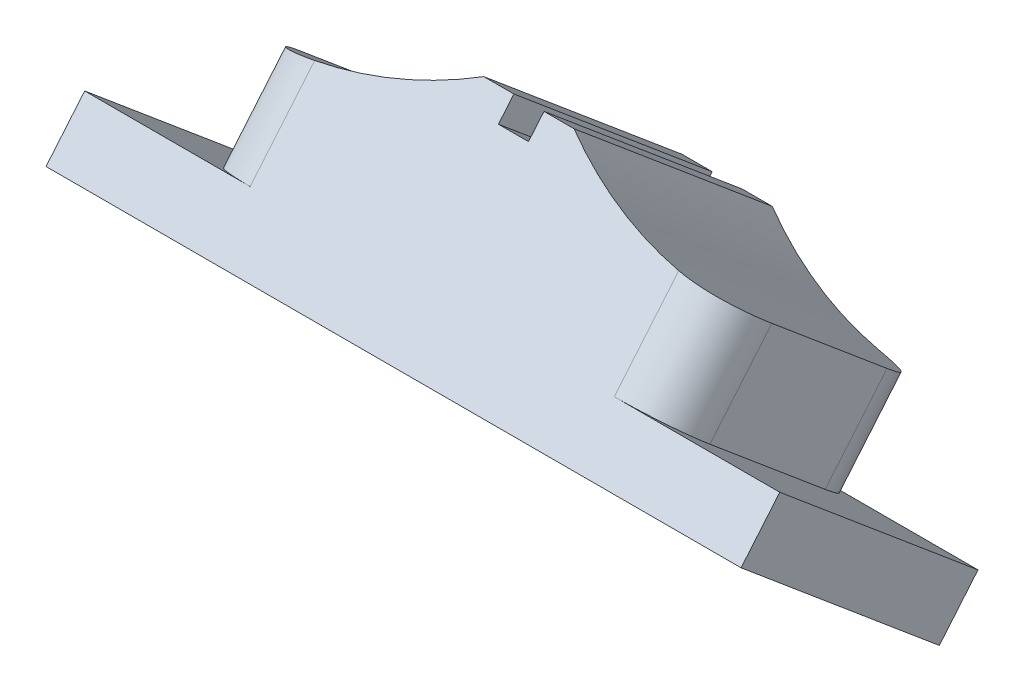
ISO-10303-21;
HEADER;
FILE_DESCRIPTION(('STEP AP214'),'2;1');
FILE_NAME('part.step','',(''),(''),'','','');
FILE_SCHEMA(('AUTOMOTIVE_DESIGN { 1 0 10303 214 1 1 1 1 }'));
ENDSEC;
DATA;
#1=APPLICATION_CONTEXT('core data for automotive mechanical design processes');
#2=APPLICATION_PROTOCOL_DEFINITION('international standard','automotive_design',2000,#1);
#3=PRODUCT_CONTEXT('',#1,'mechanical');
#4=PRODUCT('Part','Part','',(#3));
#5=PRODUCT_RELATED_PRODUCT_CATEGORY('part','',(#4));
#6=PRODUCT_DEFINITION_FORMATION('','',#4);
#7=PRODUCT_DEFINITION_CONTEXT('part definition',#1,'design');
#8=PRODUCT_DEFINITION('design','',#6,#7);
#9=PRODUCT_DEFINITION_SHAPE('','',#8);
#10=(LENGTH_UNIT() NAMED_UNIT(*) SI_UNIT(.MILLI.,.METRE.));
#11=(NAMED_UNIT(*) PLANE_ANGLE_UNIT() SI_UNIT($,.RADIAN.));
#12=(NAMED_UNIT(*) SI_UNIT($,.STERADIAN.) SOLID_ANGLE_UNIT());
#13=UNCERTAINTY_MEASURE_WITH_UNIT(LENGTH_MEASURE(1.E-05),#10,'distance_accuracy_value','');
#14=(GEOMETRIC_REPRESENTATION_CONTEXT(3) GLOBAL_UNCERTAINTY_ASSIGNED_CONTEXT((#13)) GLOBAL_UNIT_ASSIGNED_CONTEXT((#10,
#11,#12)) REPRESENTATION_CONTEXT('',''));
#15=CARTESIAN_POINT('',(0.,0.,0.));
#16=DIRECTION('',(0.,0.,1.));
#17=DIRECTION('',(1.,0.,0.));
#18=AXIS2_PLACEMENT_3D('',#15,#16,#17);
#19=CARTESIAN_POINT('',(27.,-209.156915838165,-15.7245982633083));
#20=DIRECTION('',(0.,-0.766044443118977,0.642787609686541));
#21=DIRECTION('',(0.,-0.642787609686541,-0.766044443118977));
#22=AXIS2_PLACEMENT_3D('',#19,#20,#21);
#23=PLANE('',#22);
#24=DIRECTION('',(0.,-0.642787609686541,-0.766044443118977));
#25=VECTOR('',#24,1.);
#26=CARTESIAN_POINT('',(-0.249999999999999,-213.992288139613,-21.4871705750898));
#27=LINE('',#26,#25);
#28=CARTESIAN_POINT('',(-0.249999999999999,-216.207865915071,-24.1275933486641));
#29=VERTEX_POINT('',#28);
#30=CARTESIAN_POINT('',(-0.249999999999999,-221.735839358376,-30.7155755594873));
#31=VERTEX_POINT('',#30);
#32=EDGE_CURVE('E63',#29,#31,#27,.T.);
#33=ORIENTED_EDGE('',*,*,#32,.F.);
#34=DIRECTION('',(-1.,0.,0.));
#35=VECTOR('',#34,1.);
#36=CARTESIAN_POINT('',(7.3,-216.207865915071,-24.1275933486641));
#37=LINE('',#36,#35);
#38=CARTESIAN_POINT('',(0.750000000000001,-216.207865915071,-24.1275933486641));
#39=VERTEX_POINT('',#38);
#40=EDGE_CURVE('E362',#39,#29,#37,.T.);
#41=ORIENTED_EDGE('',*,*,#40,.F.);
#42=DIRECTION('',(0.,-0.642787609686541,-0.766044443118977));
#43=VECTOR('',#42,1.);
#44=CARTESIAN_POINT('',(0.750000000000001,-213.992288139613,-21.4871705750898));
#45=LINE('',#44,#43);
#46=CARTESIAN_POINT('',(0.750000000000001,-221.735839358376,-30.7155755594874));
#47=VERTEX_POINT('',#46);
#48=EDGE_CURVE('E238',#39,#47,#45,.T.);
#49=ORIENTED_EDGE('',*,*,#48,.T.);
#50=DIRECTION('',(1.,0.,0.));
#51=VECTOR('',#50,1.);
#52=CARTESIAN_POINT('',(7.3,-221.735839358376,-30.7155755594873));
#53=LINE('',#52,#51);
#54=EDGE_CURVE('E358',#31,#47,#53,.T.);
#55=ORIENTED_EDGE('',*,*,#54,.F.);
#56=EDGE_LOOP('',(#33,#41,#49,#55));
#57=FACE_BOUND('',#56,.T.);
#58=ADVANCED_FACE('F39',(#57),#23,.F.);
#59=CARTESIAN_POINT('',(7.3,-200.196681165017,-37.5625725671458));
#60=DIRECTION('',(0.,-0.642787609686541,-0.766044443118977));
#61=DIRECTION('',(0.,0.766044443118977,-0.642787609686541));
#62=AXIS2_PLACEMENT_3D('',#59,#60,#61);
#63=PLANE('',#62);
#64=CARTESIAN_POINT('',(-6.6,-208.317076175638,-30.7487521087201));
#65=DIRECTION('',(0.,-0.642787609686541,-0.766044443118977));
#66=DIRECTION('',(0.,0.766044443118977,-0.642787609686541));
#67=AXIS2_PLACEMENT_3D('',#64,#65,#66);
#68=CIRCLE('',#67,12.1006944444446);
#69=CARTESIAN_POINT('',(-4.8,-217.483616798257,-23.0571112531094));
#70=VERTEX_POINT('',#69);
#71=EDGE_CURVE('E405',#70,#29,#68,.F.);
#72=ORIENTED_EDGE('',*,*,#71,.F.);
#73=DIRECTION('',(0.,-0.766044443118977,0.642787609686541));
#74=VECTOR('',#73,1.);
#75=CARTESIAN_POINT('',(-4.8,-200.196681165017,-37.5625725671458));
#76=LINE('',#75,#74);
#77=CARTESIAN_POINT('',(-4.8,-220.038088130667,-20.9136553002312));
#78=VERTEX_POINT('',#77);
#79=EDGE_CURVE('E388',#70,#78,#76,.T.);
#80=ORIENTED_EDGE('',*,*,#79,.T.);
#81=DIRECTION('',(-1.,0.,0.));
#82=VECTOR('',#81,1.);
#83=CARTESIAN_POINT('',(12.8,-220.038088130667,-20.9136553002312));
#84=LINE('',#83,#82);
#85=CARTESIAN_POINT('',(-10.3,-220.038088130667,-20.9136553002312));
#86=VERTEX_POINT('',#85);
#87=EDGE_CURVE('E423',#78,#86,#84,.T.);
#88=ORIENTED_EDGE('',*,*,#87,.T.);
#89=DIRECTION('',(0.,0.766044443118977,-0.642787609686541));
#90=VECTOR('',#89,1.);
#91=CARTESIAN_POINT('',(-10.3,-221.570177016904,-19.6280800808581));
#92=LINE('',#91,#90);
#93=CARTESIAN_POINT('',(-10.3,-221.570177016904,-19.6280800808581));
#94=VERTEX_POINT('',#93);
#95=EDGE_CURVE('E470',#94,#86,#92,.T.);
#96=ORIENTED_EDGE('',*,*,#95,.F.);
#97=DIRECTION('',(-1.,0.,0.));
#98=VECTOR('',#97,1.);
#99=CARTESIAN_POINT('',(12.8,-221.570177016904,-19.6280800808581));
#100=LINE('',#99,#98);
#101=CARTESIAN_POINT('',(12.8,-221.570177016904,-19.6280800808581));
#102=VERTEX_POINT('',#101);
#103=EDGE_CURVE('E483',#102,#94,#100,.T.);
#104=ORIENTED_EDGE('',*,*,#103,.F.);
#105=DIRECTION('',(0.,0.766044443118977,-0.642787609686541));
#106=VECTOR('',#105,1.);
#107=CARTESIAN_POINT('',(12.8,-221.570177016904,-19.6280800808581));
#108=LINE('',#107,#106);
#109=CARTESIAN_POINT('',(12.8,-220.038088130667,-20.9136553002312));
#110=VERTEX_POINT('',#109);
#111=EDGE_CURVE('E366',#102,#110,#108,.T.);
#112=ORIENTED_EDGE('',*,*,#111,.T.);
#113=CARTESIAN_POINT('',(7.3,-220.038088130667,-20.9136553002312));
#114=VERTEX_POINT('',#113);
#115=EDGE_CURVE('E449',#110,#114,#84,.T.);
#116=ORIENTED_EDGE('',*,*,#115,.T.);
#117=DIRECTION('',(0.,-0.766044443118977,0.642787609686541));
#118=VECTOR('',#117,1.);
#119=CARTESIAN_POINT('',(7.3,-200.196681165017,-37.5625725671458));
#120=LINE('',#119,#118);
#121=CARTESIAN_POINT('',(7.3,-217.483616798257,-23.0571112531094));
#122=VERTEX_POINT('',#121);
#123=EDGE_CURVE('E386',#122,#114,#120,.T.);
#124=ORIENTED_EDGE('',*,*,#123,.F.);
#125=CARTESIAN_POINT('',(9.1,-208.317076175638,-30.7487521087201));
#126=DIRECTION('',(0.,-0.642787609686541,-0.766044443118977));
#127=DIRECTION('',(0.,0.766044443118977,-0.642787609686541));
#128=AXIS2_PLACEMENT_3D('',#125,#126,#127);
#129=CIRCLE('',#128,12.1006944444446);
#130=CARTESIAN_POINT('',(2.75,-216.207865915071,-24.1275933486641));
#131=VERTEX_POINT('',#130);
#132=EDGE_CURVE('E310',#122,#131,#129,.T.);
#133=ORIENTED_EDGE('',*,*,#132,.T.);
#134=CARTESIAN_POINT('',(1.75,-216.207865915071,-24.1275933486641));
#135=VERTEX_POINT('',#134);
#136=EDGE_CURVE('E359',#131,#135,#37,.T.);
#137=ORIENTED_EDGE('',*,*,#136,.T.);
#138=DIRECTION('',(0.,-0.766044443118977,0.642787609686541));
#139=VECTOR('',#138,1.);
#140=CARTESIAN_POINT('',(1.75000000000001,-200.196681165017,-37.5625725671458));
#141=LINE('',#140,#139);
#142=CARTESIAN_POINT('',(1.75,-216.820701469567,-23.6133632609148));
#143=VERTEX_POINT('',#142);
#144=EDGE_CURVE('E309',#135,#143,#141,.T.);
#145=ORIENTED_EDGE('',*,*,#144,.T.);
#146=DIRECTION('',(-1.,0.,0.));
#147=VECTOR('',#146,1.);
#148=CARTESIAN_POINT('',(7.3,-216.820701469567,-23.6133632609149));
#149=LINE('',#148,#147);
#150=CARTESIAN_POINT('',(0.750000000000001,-216.820701469567,-23.6133632609149));
#151=VERTEX_POINT('',#150);
#152=EDGE_CURVE('E487',#143,#151,#149,.T.);
#153=ORIENTED_EDGE('',*,*,#152,.T.);
#154=DIRECTION('',(0.,-0.766044443118977,0.642787609686541));
#155=VECTOR('',#154,1.);
#156=CARTESIAN_POINT('',(0.749999999999995,-200.196681165017,-37.5625725671458));
#157=LINE('',#156,#155);
#158=EDGE_CURVE('E236',#39,#151,#157,.T.);
#159=ORIENTED_EDGE('',*,*,#158,.F.);
#160=ORIENTED_EDGE('',*,*,#40,.T.);
#161=EDGE_LOOP('',(#72,#80,#88,#96,#104,#112,#116,#124,#133,#137,#145,#153,#159,#160));
#162=FACE_BOUND('',#161,.T.);
#163=ADVANCED_FACE('F328',(#162),#63,.F.);
#164=CARTESIAN_POINT('',(-4.8,-201.353698862453,-38.94145256476));
#165=DIRECTION('',(0.,-0.766044443118977,0.642787609686541));
#166=DIRECTION('',(0.,-0.642787609686541,-0.766044443118977));
#167=AXIS2_PLACEMENT_3D('',#164,#165,#166);
#168=CYLINDRICAL_SURFACE('',#167,1.8);
#169=CARTESIAN_POINT('',(-6.6,-218.743763610121,-24.3494556488425));
#170=CARTESIAN_POINT('',(-6.59999966179535,-218.711216927281,-24.3106708694511));
#171=CARTESIAN_POINT('',(-6.59786237184818,-218.67868879528,-24.2719021844097));
#172=CARTESIAN_POINT('',(-6.58933583716871,-218.613859150343,-24.1946471296032));
#173=CARTESIAN_POINT('',(-6.58294679242873,-218.58155762682,-24.1561607466454));
#174=CARTESIAN_POINT('',(-6.55746204084385,-218.485376017672,-24.0416178597754));
#175=CARTESIAN_POINT('',(-6.53204855282895,-218.422112831963,-23.9663510716901));
#176=CARTESIAN_POINT('',(-6.46507882809616,-218.298921130653,-23.8204120015759));
#177=CARTESIAN_POINT('',(-6.42351464666623,-218.238994272842,-23.7497420007635));
#178=CARTESIAN_POINT('',(-6.32543055905766,-218.123810646473,-23.615317164807));
#179=CARTESIAN_POINT('',(-6.26891323664157,-218.068553073281,-23.5515611376739));
#180=CARTESIAN_POINT('',(-6.14260171407535,-217.963876831797,-23.4332204805273));
#181=CARTESIAN_POINT('',(-6.07281996597732,-217.914452757252,-23.3786273385959));
#182=CARTESIAN_POINT('',(-5.92195570145169,-217.822293342143,-23.2805004691987));
#183=CARTESIAN_POINT('',(-5.84087202352257,-217.779558690012,-23.2369678797277));
#184=CARTESIAN_POINT('',(-5.6701204672671,-217.701671513935,-23.1627343749576));
#185=CARTESIAN_POINT('',(-5.58048542638977,-217.666491548154,-23.1319866249121));
#186=CARTESIAN_POINT('',(-5.39501056807457,-217.604087959236,-23.0842547732217));
#187=CARTESIAN_POINT('',(-5.2991734566593,-217.576860894382,-23.067264712109));
#188=CARTESIAN_POINT('',(-5.13565507629158,-217.538222351952,-23.0508103672926));
#189=CARTESIAN_POINT('',(-5.06886416147179,-217.524542285825,-23.0474605166935));
#190=CARTESIAN_POINT('',(-4.93469345611138,-217.501120711929,-23.0473546133302));
#191=CARTESIAN_POINT('',(-4.86731470650679,-217.49137329087,-23.0505886162018));
#192=CARTESIAN_POINT('',(-4.79999999999999,-217.483616798257,-23.0571112531094));
#193=B_SPLINE_CURVE_WITH_KNOTS('',3,(#169,#170,#171,#172,#173,#174,#175,#176,#177,#178,#179,
#180,#181,#182,#183,#184,#185,#186,#187,#188,#189,#190,#191,#192),.UNSPECIFIED.,.F.,.F.,(4,2,2,
2,2,2,2,2,2,2,2,4),(0.,0.151801135425005,0.303595130994921,0.606694079127453,0.909942314257672,
1.21313818511806,1.51605082243569,1.8189946131278,2.12081863755165,2.42251184972324,
2.6268825234993,2.83094474136437),.UNSPECIFIED.);
#194=CARTESIAN_POINT('',(-6.6,-218.743763610121,-24.3494556488425));
#195=VERTEX_POINT('',#194);
#196=EDGE_CURVE('E253',#195,#70,#193,.T.);
#197=ORIENTED_EDGE('',*,*,#196,.F.);
#198=DIRECTION('',(0.,-0.766044443118977,0.642787609686541));
#199=VECTOR('',#198,1.);
#200=CARTESIAN_POINT('',(-6.6,-201.353698862453,-38.94145256476));
#201=LINE('',#200,#199);
#202=CARTESIAN_POINT('',(-6.6,-221.195105828102,-22.2925352978454));
#203=VERTEX_POINT('',#202);
#204=EDGE_CURVE('E390',#195,#203,#201,.T.);
#205=ORIENTED_EDGE('',*,*,#204,.T.);
#206=CARTESIAN_POINT('',(-4.8,-221.195105828102,-22.2925352978454));
#207=DIRECTION('',(0.,0.766044443118977,-0.642787609686541));
#208=DIRECTION('',(0.,0.642787609686541,0.766044443118977));
#209=AXIS2_PLACEMENT_3D('',#206,#207,#208);
#210=CIRCLE('',#209,1.8);
#211=EDGE_CURVE('E383',#203,#78,#210,.T.);
#212=ORIENTED_EDGE('',*,*,#211,.T.);
#213=ORIENTED_EDGE('',*,*,#79,.F.);
#214=EDGE_LOOP('',(#197,#205,#212,#213));
#215=FACE_BOUND('',#214,.T.);
#216=ADVANCED_FACE('F336',(#215),#168,.T.);
#217=CARTESIAN_POINT('',(-6.6,-204.567636910886,-42.7716747803549));
#218=DIRECTION('',(1.,0.,0.));
#219=DIRECTION('',(0.,0.,-1.));
#220=AXIS2_PLACEMENT_3D('',#217,#218,#219);
#221=PLANE('',#220);
#222=DIRECTION('',(0.,-0.642787609686541,-0.766044443118977));
#223=VECTOR('',#222,1.);
#224=CARTESIAN_POINT('',(-6.6,-215.371168137227,-20.330152877654));
#225=LINE('',#224,#223);
#226=CARTESIAN_POINT('',(-6.6,-221.957701658554,-28.1796778644374));
#227=VERTEX_POINT('',#226);
#228=EDGE_CURVE('E233',#195,#227,#225,.T.);
#229=ORIENTED_EDGE('',*,*,#228,.T.);
#230=DIRECTION('',(0.,-0.766044443118977,0.642787609686541));
#231=VECTOR('',#230,1.);
#232=CARTESIAN_POINT('',(-6.6,-204.567636910886,-42.7716747803549));
#233=LINE('',#232,#231);
#234=CARTESIAN_POINT('',(-6.6,-224.409043876535,-26.1227575134403));
#235=VERTEX_POINT('',#234);
#236=EDGE_CURVE('E392',#227,#235,#233,.T.);
#237=ORIENTED_EDGE('',*,*,#236,.T.);
#238=DIRECTION('',(0.,0.642787609686541,0.766044443118977));
#239=VECTOR('',#238,1.);
#240=CARTESIAN_POINT('',(-6.6,-224.409043876535,-26.1227575134403));
#241=LINE('',#240,#239);
#242=EDGE_CURVE('E380',#235,#203,#241,.T.);
#243=ORIENTED_EDGE('',*,*,#242,.T.);
#244=ORIENTED_EDGE('',*,*,#204,.F.);
#245=EDGE_LOOP('',(#229,#237,#243,#244));
#246=FACE_BOUND('',#245,.T.);
#247=ADVANCED_FACE('F417',(#246),#221,.F.);
#248=CARTESIAN_POINT('',(-4.8,-204.567636910886,-42.7716747803549));
#249=DIRECTION('',(0.,-0.766044443118977,0.642787609686541));
#250=DIRECTION('',(0.,-0.642787609686541,-0.766044443118977));
#251=AXIS2_PLACEMENT_3D('',#248,#249,#250);
#252=CYLINDRICAL_SURFACE('',#251,1.8);
#253=CARTESIAN_POINT('',(-4.8,-223.011590241561,-29.6450934639326));
#254=CARTESIAN_POINT('',(-4.85002593929264,-223.017355969617,-29.6402550297818));
#255=CARTESIAN_POINT('',(-4.9000773348671,-223.021534870338,-29.6340246262905));
#256=CARTESIAN_POINT('',(-4.99992407313687,-223.026696305438,-29.6187961018725));
#257=CARTESIAN_POINT('',(-5.04971940980163,-223.027678764877,-29.6097979160615));
#258=CARTESIAN_POINT('',(-5.19810852305616,-223.0257990025,-29.578707634874));
#259=CARTESIAN_POINT('',(-5.29585760627287,-223.018127091537,-29.5525051629519));
#260=CARTESIAN_POINT('',(-5.48608406065805,-222.990269487934,-29.4895840256825));
#261=CARTESIAN_POINT('',(-5.57855699387746,-222.970073425439,-29.452856659411));
#262=CARTESIAN_POINT('',(-5.75544396623429,-222.918055789415,-29.3695832304336));
#263=CARTESIAN_POINT('',(-5.83986032942773,-222.886237581355,-29.3230400117898));
#264=CARTESIAN_POINT('',(-5.99769851037351,-222.812531760104,-29.2213579174124));
#265=CARTESIAN_POINT('',(-6.07118088606056,-222.770703233667,-29.1662701242699));
#266=CARTESIAN_POINT('',(-6.20563489986615,-222.678531170319,-29.0484372443728));
#267=CARTESIAN_POINT('',(-6.26660354756978,-222.628185603317,-28.9856903330126));
#268=CARTESIAN_POINT('',(-6.37441281186356,-222.520738556198,-28.8537625580237));
#269=CARTESIAN_POINT('',(-6.42121574722439,-222.463619610091,-28.7845651636937));
#270=CARTESIAN_POINT('',(-6.49913525669522,-222.344753240664,-28.6415038562353));
#271=CARTESIAN_POINT('',(-6.53026016657057,-222.283008297021,-28.5676424464518));
#272=CARTESIAN_POINT('',(-6.56868920590301,-222.177041619464,-28.4411243725145));
#273=CARTESIAN_POINT('',(-6.58042198918019,-222.133497474741,-28.3892009588344));
#274=CARTESIAN_POINT('',(-6.5960775677556,-222.04587151938,-28.2847545607563));
#275=CARTESIAN_POINT('',(-6.60001069469646,-222.001790497933,-28.2322324623272));
#276=CARTESIAN_POINT('',(-6.6,-221.957701658554,-28.1796778644374));
#277=B_SPLINE_CURVE_WITH_KNOTS('',3,(#253,#254,#255,#256,#257,#258,#259,#260,#261,#262,#263,
#264,#265,#266,#267,#268,#269,#270,#271,#272,#273,#274,#275,#276),.UNSPECIFIED.,.F.,.F.,(4,2,2,
2,2,2,2,2,2,2,2,4),(0.,0.151677203514404,0.303357963028675,0.606263614210116,0.909420403308197,
1.21248947561159,1.5138119602508,1.81520636852523,2.11739558825738,2.41942396858149,
2.62532302889021,2.83094916688487),.UNSPECIFIED.);
#278=CARTESIAN_POINT('',(-4.79999999999999,-223.011590241561,-29.6450934639327));
#279=VERTEX_POINT('',#278);
#280=EDGE_CURVE('E245',#279,#227,#277,.T.);
#281=ORIENTED_EDGE('',*,*,#280,.F.);
#282=DIRECTION('',(0.,-0.766044443118977,0.642787609686541));
#283=VECTOR('',#282,1.);
#284=CARTESIAN_POINT('',(-4.8,-205.724654608322,-44.150554777969));
#285=LINE('',#284,#283);
#286=CARTESIAN_POINT('',(-4.8,-225.566061573971,-27.5016375110545));
#287=VERTEX_POINT('',#286);
#288=EDGE_CURVE('E394',#279,#287,#285,.T.);
#289=ORIENTED_EDGE('',*,*,#288,.T.);
#290=CARTESIAN_POINT('',(-4.8,-224.409043876535,-26.1227575134403));
#291=DIRECTION('',(0.,0.766044443118977,-0.642787609686541));
#292=DIRECTION('',(0.,0.642787609686541,0.766044443118977));
#293=AXIS2_PLACEMENT_3D('',#290,#291,#292);
#294=CIRCLE('',#293,1.8);
#295=EDGE_CURVE('E377',#287,#235,#294,.T.);
#296=ORIENTED_EDGE('',*,*,#295,.T.);
#297=ORIENTED_EDGE('',*,*,#236,.F.);
#298=EDGE_LOOP('',(#281,#289,#296,#297));
#299=FACE_BOUND('',#298,.T.);
#300=ADVANCED_FACE('F260',(#299),#252,.T.);
#301=CARTESIAN_POINT('',(7.3,-205.724654608322,-44.150554777969));
#302=DIRECTION('',(0.,0.642787609686541,0.766044443118977));
#303=DIRECTION('',(0.,-0.766044443118977,0.642787609686541));
#304=AXIS2_PLACEMENT_3D('',#301,#302,#303);
#305=PLANE('',#304);
#306=CARTESIAN_POINT('',(-6.6,-213.845049618942,-37.3367343195434));
#307=DIRECTION('',(0.,0.642787609686541,0.766044443118977));
#308=DIRECTION('',(0.,-0.766044443118977,0.642787609686541));
#309=AXIS2_PLACEMENT_3D('',#306,#307,#308);
#310=CIRCLE('',#309,12.1006944444446);
#311=EDGE_CURVE('E230',#279,#31,#310,.T.);
#312=ORIENTED_EDGE('',*,*,#311,.T.);
#313=ORIENTED_EDGE('',*,*,#54,.T.);
#314=DIRECTION('',(0.,-0.766044443118977,0.64278760968654));
#315=VECTOR('',#314,1.);
#316=CARTESIAN_POINT('',(0.750000000000001,-222.348674912871,-30.2013454717382));
#317=LINE('',#316,#315);
#318=CARTESIAN_POINT('',(0.750000000000001,-222.348674912871,-30.2013454717382));
#319=VERTEX_POINT('',#318);
#320=EDGE_CURVE('E224',#47,#319,#317,.T.);
#321=ORIENTED_EDGE('',*,*,#320,.T.);
#322=DIRECTION('',(-1.,0.,0.));
#323=VECTOR('',#322,1.);
#324=CARTESIAN_POINT('',(1.25,-222.348674912871,-30.2013454717382));
#325=LINE('',#324,#323);
#326=CARTESIAN_POINT('',(1.75,-222.348674912871,-30.2013454717382));
#327=VERTEX_POINT('',#326);
#328=EDGE_CURVE('E432',#327,#319,#325,.T.);
#329=ORIENTED_EDGE('',*,*,#328,.F.);
#330=DIRECTION('',(0.,-0.766044443118977,0.64278760968654));
#331=VECTOR('',#330,1.);
#332=CARTESIAN_POINT('',(1.75,-222.348674912871,-30.2013454717382));
#333=LINE('',#332,#331);
#334=CARTESIAN_POINT('',(1.75,-221.735839358376,-30.7155755594874));
#335=VERTEX_POINT('',#334);
#336=EDGE_CURVE('E427',#335,#327,#333,.T.);
#337=ORIENTED_EDGE('',*,*,#336,.F.);
#338=CARTESIAN_POINT('',(2.7499999999999,-221.735839358376,-30.7155755594873));
#339=VERTEX_POINT('',#338);
#340=EDGE_CURVE('E352',#335,#339,#53,.T.);
#341=ORIENTED_EDGE('',*,*,#340,.T.);
#342=CARTESIAN_POINT('',(9.1,-213.845049618942,-37.3367343195434));
#343=DIRECTION('',(0.,-0.642787609686541,-0.766044443118977));
#344=DIRECTION('',(0.,-0.766044443118977,0.642787609686541));
#345=AXIS2_PLACEMENT_3D('',#342,#343,#344);
#346=CIRCLE('',#345,12.1006944444446);
#347=CARTESIAN_POINT('',(7.3,-223.011590241561,-29.6450934639327));
#348=VERTEX_POINT('',#347);
#349=EDGE_CURVE('E426',#348,#339,#346,.T.);
#350=ORIENTED_EDGE('',*,*,#349,.F.);
#351=DIRECTION('',(0.,-0.766044443118977,0.642787609686541));
#352=VECTOR('',#351,1.);
#353=CARTESIAN_POINT('',(7.3,-205.724654608322,-44.150554777969));
#354=LINE('',#353,#352);
#355=CARTESIAN_POINT('',(7.3,-225.566061573971,-27.5016375110545));
#356=VERTEX_POINT('',#355);
#357=EDGE_CURVE('E396',#348,#356,#354,.T.);
#358=ORIENTED_EDGE('',*,*,#357,.T.);
#359=DIRECTION('',(1.,0.,0.));
#360=VECTOR('',#359,1.);
#361=CARTESIAN_POINT('',(12.8,-225.566061573971,-27.5016375110545));
#362=LINE('',#361,#360);
#363=CARTESIAN_POINT('',(12.8,-225.566061573971,-27.5016375110545));
#364=VERTEX_POINT('',#363);
#365=EDGE_CURVE('E455',#356,#364,#362,.T.);
#366=ORIENTED_EDGE('',*,*,#365,.T.);
#367=DIRECTION('',(0.,0.766044443118977,-0.642787609686541));
#368=VECTOR('',#367,1.);
#369=CARTESIAN_POINT('',(12.8,-227.098150460209,-26.2160622916814));
#370=LINE('',#369,#368);
#371=CARTESIAN_POINT('',(12.8,-227.098150460209,-26.2160622916814));
#372=VERTEX_POINT('',#371);
#373=EDGE_CURVE('E464',#372,#364,#370,.T.);
#374=ORIENTED_EDGE('',*,*,#373,.F.);
#375=DIRECTION('',(1.,0.,0.));
#376=VECTOR('',#375,1.);
#377=CARTESIAN_POINT('',(12.8,-227.098150460209,-26.2160622916814));
#378=LINE('',#377,#376);
#379=CARTESIAN_POINT('',(-10.3,-227.098150460209,-26.2160622916814));
#380=VERTEX_POINT('',#379);
#381=EDGE_CURVE('E468',#380,#372,#378,.T.);
#382=ORIENTED_EDGE('',*,*,#381,.F.);
#383=DIRECTION('',(0.,0.766044443118977,-0.642787609686541));
#384=VECTOR('',#383,1.);
#385=CARTESIAN_POINT('',(-10.3,-227.098150460209,-26.2160622916814));
#386=LINE('',#385,#384);
#387=CARTESIAN_POINT('',(-10.3,-225.566061573971,-27.5016375110545));
#388=VERTEX_POINT('',#387);
#389=EDGE_CURVE('E467',#380,#388,#386,.T.);
#390=ORIENTED_EDGE('',*,*,#389,.T.);
#391=EDGE_CURVE('E461',#388,#287,#362,.T.);
#392=ORIENTED_EDGE('',*,*,#391,.T.);
#393=ORIENTED_EDGE('',*,*,#288,.F.);
#394=EDGE_LOOP('',(#312,#313,#321,#329,#337,#341,#350,#358,#366,#374,#382,#390,#392,#393));
#395=FACE_BOUND('',#394,.T.);
#396=ADVANCED_FACE('F316',(#395),#305,.F.);
#397=CARTESIAN_POINT('',(7.3,-204.567636910886,-42.7716747803549));
#398=DIRECTION('',(0.,-0.766044443118977,0.642787609686541));
#399=DIRECTION('',(0.,-0.642787609686541,-0.766044443118977));
#400=AXIS2_PLACEMENT_3D('',#397,#398,#399);
#401=CYLINDRICAL_SURFACE('',#400,1.8);
#402=ORIENTED_EDGE('',*,*,#357,.F.);
#403=CARTESIAN_POINT('',(7.3,-223.011590241561,-29.6450934639326));
#404=CARTESIAN_POINT('',(7.35002593929264,-223.017355969617,-29.6402550297818));
#405=CARTESIAN_POINT('',(7.4000773348671,-223.021534870338,-29.6340246262905));
#406=CARTESIAN_POINT('',(7.49992407313687,-223.026696305438,-29.6187961018726));
#407=CARTESIAN_POINT('',(7.54971940980163,-223.027678764877,-29.6097979160615));
#408=CARTESIAN_POINT('',(7.69810852305616,-223.0257990025,-29.578707634874));
#409=CARTESIAN_POINT('',(7.79585760627287,-223.018127091537,-29.5525051629519));
#410=CARTESIAN_POINT('',(7.98608406065805,-222.990269487934,-29.4895840256825));
#411=CARTESIAN_POINT('',(8.07855699387745,-222.970073425439,-29.4528566594111));
#412=CARTESIAN_POINT('',(8.25544396623428,-222.918055789415,-29.3695832304336));
#413=CARTESIAN_POINT('',(8.33986032942773,-222.886237581355,-29.3230400117898));
#414=CARTESIAN_POINT('',(8.49769851037351,-222.812531760104,-29.2213579174124));
#415=CARTESIAN_POINT('',(8.57118088606056,-222.770703233667,-29.1662701242699));
#416=CARTESIAN_POINT('',(8.70563489986614,-222.678531170319,-29.0484372443728));
#417=CARTESIAN_POINT('',(8.76660354756978,-222.628185603317,-28.9856903330126));
#418=CARTESIAN_POINT('',(8.87441281186355,-222.520738556198,-28.8537625580237));
#419=CARTESIAN_POINT('',(8.92121574722439,-222.463619610091,-28.7845651636938));
#420=CARTESIAN_POINT('',(8.99913525669522,-222.344753240664,-28.6415038562353));
#421=CARTESIAN_POINT('',(9.03026016657057,-222.283008297021,-28.5676424464518));
#422=CARTESIAN_POINT('',(9.06868920590301,-222.177041619464,-28.4411243725145));
#423=CARTESIAN_POINT('',(9.08042198918019,-222.133497474741,-28.3892009588344));
#424=CARTESIAN_POINT('',(9.0960775677556,-222.04587151938,-28.2847545607563));
#425=CARTESIAN_POINT('',(9.10001069469646,-222.001790497933,-28.2322324623272));
#426=CARTESIAN_POINT('',(9.1,-221.957701658554,-28.1796778644374));
#427=B_SPLINE_CURVE_WITH_KNOTS('',3,(#403,#404,#405,#406,#407,#408,#409,#410,#411,#412,#413,
#414,#415,#416,#417,#418,#419,#420,#421,#422,#423,#424,#425,#426),.UNSPECIFIED.,.F.,.F.,(4,2,2,
2,2,2,2,2,2,2,2,4),(0.,0.151677203514401,0.303357963028673,0.606263614210111,0.909420403308189,
1.21248947561158,1.51381196025079,1.81520636852523,2.11739558825737,2.41942396858148,
2.6253230288902,2.83094916688487),.UNSPECIFIED.);
#428=CARTESIAN_POINT('',(9.1,-221.957701658554,-28.1796778644373));
#429=VERTEX_POINT('',#428);
#430=EDGE_CURVE('E301',#348,#429,#427,.T.);
#431=ORIENTED_EDGE('',*,*,#430,.T.);
#432=DIRECTION('',(0.,-0.766044443118977,0.642787609686541));
#433=VECTOR('',#432,1.);
#434=CARTESIAN_POINT('',(9.1,-204.567636910886,-42.7716747803549));
#435=LINE('',#434,#433);
#436=CARTESIAN_POINT('',(9.1,-224.409043876535,-26.1227575134402));
#437=VERTEX_POINT('',#436);
#438=EDGE_CURVE('E398',#429,#437,#435,.T.);
#439=ORIENTED_EDGE('',*,*,#438,.T.);
#440=CARTESIAN_POINT('',(7.3,-224.409043876535,-26.1227575134403));
#441=DIRECTION('',(0.,0.766044443118977,-0.642787609686541));
#442=DIRECTION('',(0.,0.642787609686541,0.766044443118977));
#443=AXIS2_PLACEMENT_3D('',#440,#441,#442);
#444=CIRCLE('',#443,1.8);
#445=EDGE_CURVE('E374',#437,#356,#444,.T.);
#446=ORIENTED_EDGE('',*,*,#445,.T.);
#447=EDGE_LOOP('',(#402,#431,#439,#446));
#448=FACE_BOUND('',#447,.T.);
#449=ADVANCED_FACE('F312',(#448),#401,.T.);
#450=CARTESIAN_POINT('',(9.1,-201.353698862453,-38.94145256476));
#451=DIRECTION('',(-1.,0.,0.));
#452=DIRECTION('',(0.,0.,1.));
#453=AXIS2_PLACEMENT_3D('',#450,#451,#452);
#454=PLANE('',#453);
#455=ORIENTED_EDGE('',*,*,#438,.F.);
#456=DIRECTION('',(0.,-0.642787609686541,-0.766044443118977));
#457=VECTOR('',#456,1.);
#458=CARTESIAN_POINT('',(9.1,-61.3379630072688,163.239472714774));
#459=LINE('',#458,#457);
#460=CARTESIAN_POINT('',(9.1,-218.743763610121,-24.3494556488425));
#461=VERTEX_POINT('',#460);
#462=EDGE_CURVE('E434',#461,#429,#459,.T.);
#463=ORIENTED_EDGE('',*,*,#462,.F.);
#464=DIRECTION('',(0.,-0.766044443118977,0.642787609686541));
#465=VECTOR('',#464,1.);
#466=CARTESIAN_POINT('',(9.1,-201.353698862453,-38.94145256476));
#467=LINE('',#466,#465);
#468=CARTESIAN_POINT('',(9.1,-221.195105828102,-22.2925352978454));
#469=VERTEX_POINT('',#468);
#470=EDGE_CURVE('E400',#461,#469,#467,.T.);
#471=ORIENTED_EDGE('',*,*,#470,.T.);
#472=DIRECTION('',(0.,-0.642787609686541,-0.766044443118977));
#473=VECTOR('',#472,1.);
#474=CARTESIAN_POINT('',(9.1,-221.195105828102,-22.2925352978454));
#475=LINE('',#474,#473);
#476=EDGE_CURVE('E371',#469,#437,#475,.T.);
#477=ORIENTED_EDGE('',*,*,#476,.T.);
#478=EDGE_LOOP('',(#455,#463,#471,#477));
#479=FACE_BOUND('',#478,.T.);
#480=ADVANCED_FACE('F315',(#479),#454,.F.);
#481=CARTESIAN_POINT('',(7.3,-201.353698862453,-38.94145256476));
#482=DIRECTION('',(0.,-0.766044443118977,0.642787609686541));
#483=DIRECTION('',(0.,-0.642787609686541,-0.766044443118977));
#484=AXIS2_PLACEMENT_3D('',#481,#482,#483);
#485=CYLINDRICAL_SURFACE('',#484,1.8);
#486=ORIENTED_EDGE('',*,*,#470,.F.);
#487=CARTESIAN_POINT('',(9.1,-218.743763610121,-24.3494556488425));
#488=CARTESIAN_POINT('',(9.09999966179536,-218.711216927281,-24.3106708694511));
#489=CARTESIAN_POINT('',(9.09786237184818,-218.67868879528,-24.2719021844097));
#490=CARTESIAN_POINT('',(9.08933583716872,-218.613859150343,-24.1946471296033));
#491=CARTESIAN_POINT('',(9.08294679242873,-218.58155762682,-24.1561607466455));
#492=CARTESIAN_POINT('',(9.05746204084385,-218.485376017672,-24.0416178597754));
#493=CARTESIAN_POINT('',(9.03204855282896,-218.422112831963,-23.9663510716901));
#494=CARTESIAN_POINT('',(8.96507882809616,-218.298921130653,-23.8204120015759));
#495=CARTESIAN_POINT('',(8.92351464666624,-218.238994272842,-23.7497420007635));
#496=CARTESIAN_POINT('',(8.82543055905767,-218.123810646473,-23.615317164807));
#497=CARTESIAN_POINT('',(8.76891323664158,-218.068553073281,-23.5515611376739));
#498=CARTESIAN_POINT('',(8.64260171407536,-217.963876831797,-23.4332204805273));
#499=CARTESIAN_POINT('',(8.57281996597734,-217.914452757252,-23.3786273385959));
#500=CARTESIAN_POINT('',(8.42195570145172,-217.822293342143,-23.2805004691987));
#501=CARTESIAN_POINT('',(8.34087202352259,-217.779558690012,-23.2369678797277));
#502=CARTESIAN_POINT('',(8.17012046726712,-217.701671513935,-23.1627343749577));
#503=CARTESIAN_POINT('',(8.08048542638979,-217.666491548154,-23.1319866249121));
#504=CARTESIAN_POINT('',(7.89501056807458,-217.604087959236,-23.0842547732217));
#505=CARTESIAN_POINT('',(7.79917345665931,-217.576860894382,-23.067264712109));
#506=CARTESIAN_POINT('',(7.63565507629159,-217.538222351952,-23.0508103672926));
#507=CARTESIAN_POINT('',(7.5688641614718,-217.524542285825,-23.0474605166935));
#508=CARTESIAN_POINT('',(7.43469345611138,-217.501120711929,-23.0473546133302));
#509=CARTESIAN_POINT('',(7.36731470650679,-217.49137329087,-23.0505886162018));
#510=CARTESIAN_POINT('',(7.29999999999999,-217.483616798257,-23.0571112531094));
#511=B_SPLINE_CURVE_WITH_KNOTS('',3,(#487,#488,#489,#490,#491,#492,#493,#494,#495,#496,#497,
#498,#499,#500,#501,#502,#503,#504,#505,#506,#507,#508,#509,#510),.UNSPECIFIED.,.F.,.F.,(4,2,2,
2,2,2,2,2,2,2,2,4),(0.,0.151801135424992,0.303595130994887,0.606694079127446,0.909942314257661,
1.21313818511805,1.51605082243568,1.81899461312779,2.12081863755164,2.42251184972324,
2.62688252349931,2.83094474136437),.UNSPECIFIED.);
#512=EDGE_CURVE('E293',#461,#122,#511,.T.);
#513=ORIENTED_EDGE('',*,*,#512,.T.);
#514=ORIENTED_EDGE('',*,*,#123,.T.);
#515=CARTESIAN_POINT('',(7.3,-221.195105828102,-22.2925352978454));
#516=DIRECTION('',(0.,0.766044443118977,-0.642787609686541));
#517=DIRECTION('',(0.,-0.642787609686541,-0.766044443118977));
#518=AXIS2_PLACEMENT_3D('',#515,#516,#517);
#519=CIRCLE('',#518,1.8);
#520=EDGE_CURVE('E368',#114,#469,#519,.T.);
#521=ORIENTED_EDGE('',*,*,#520,.T.);
#522=EDGE_LOOP('',(#486,#513,#514,#521));
#523=FACE_BOUND('',#522,.T.);
#524=ADVANCED_FACE('F41',(#523),#485,.T.);
#525=ORIENTED_EDGE('',*,*,#340,.F.);
#526=DIRECTION('',(0.,0.642787609686541,0.766044443118977));
#527=VECTOR('',#526,1.);
#528=CARTESIAN_POINT('',(1.75,-209.156915838165,-15.7245982633083));
#529=LINE('',#528,#527);
#530=EDGE_CURVE('E11',#335,#135,#529,.T.);
#531=ORIENTED_EDGE('',*,*,#530,.T.);
#532=ORIENTED_EDGE('',*,*,#136,.F.);
#533=DIRECTION('',(0.,-0.642787609686541,-0.766044443118977));
#534=VECTOR('',#533,1.);
#535=CARTESIAN_POINT('',(2.74999999999991,-59.9590830096547,162.082455017338));
#536=LINE('',#535,#534);
#537=EDGE_CURVE('E48',#131,#339,#536,.T.);
#538=ORIENTED_EDGE('',*,*,#537,.T.);
#539=EDGE_LOOP('',(#525,#531,#532,#538));
#540=FACE_BOUND('',#539,.T.);
#541=ADVANCED_FACE('F324',(#540),#23,.F.);
#542=CARTESIAN_POINT('',(0.,-118.825685634189,99.7065889900361));
#543=DIRECTION('',(0.,0.766044443118977,-0.642787609686541));
#544=DIRECTION('',(0.,0.642787609686541,0.766044443118977));
#545=AXIS2_PLACEMENT_3D('',#542,#543,#544);
#546=PLANE('',#545);
#547=ORIENTED_EDGE('',*,*,#211,.F.);
#548=ORIENTED_EDGE('',*,*,#242,.F.);
#549=ORIENTED_EDGE('',*,*,#295,.F.);
#550=ORIENTED_EDGE('',*,*,#391,.F.);
#551=DIRECTION('',(0.,-0.642787609686541,-0.766044443118977));
#552=VECTOR('',#551,1.);
#553=CARTESIAN_POINT('',(-10.3,-220.038088130667,-20.9136553002312));
#554=LINE('',#553,#552);
#555=EDGE_CURVE('E453',#86,#388,#554,.T.);
#556=ORIENTED_EDGE('',*,*,#555,.F.);
#557=ORIENTED_EDGE('',*,*,#87,.F.);
#558=EDGE_LOOP('',(#547,#548,#549,#550,#556,#557));
#559=FACE_BOUND('',#558,.T.);
#560=ADVANCED_FACE('F341',(#559),#546,.T.);
#561=CARTESIAN_POINT('',(12.8,-221.570177016904,-19.6280800808581));
#562=DIRECTION('',(-1.,0.,0.));
#563=DIRECTION('',(0.,0.,1.));
#564=AXIS2_PLACEMENT_3D('',#561,#562,#563);
#565=PLANE('',#564);
#566=DIRECTION('',(0.,0.642787609686541,0.766044443118977));
#567=VECTOR('',#566,1.);
#568=CARTESIAN_POINT('',(12.8,-220.038088130667,-20.9136553002312));
#569=LINE('',#568,#567);
#570=EDGE_CURVE('E457',#364,#110,#569,.T.);
#571=ORIENTED_EDGE('',*,*,#570,.T.);
#572=ORIENTED_EDGE('',*,*,#111,.F.);
#573=DIRECTION('',(0.,0.642787609686541,0.766044443118977));
#574=VECTOR('',#573,1.);
#575=CARTESIAN_POINT('',(12.8,-221.570177016904,-19.6280800808581));
#576=LINE('',#575,#574);
#577=EDGE_CURVE('E463',#372,#102,#576,.T.);
#578=ORIENTED_EDGE('',*,*,#577,.F.);
#579=ORIENTED_EDGE('',*,*,#373,.T.);
#580=EDGE_LOOP('',(#571,#572,#578,#579));
#581=FACE_BOUND('',#580,.T.);
#582=ADVANCED_FACE('F347',(#581),#565,.F.);
#583=CARTESIAN_POINT('',(-10.3,-221.570177016904,-19.6280800808581));
#584=DIRECTION('',(1.,0.,0.));
#585=DIRECTION('',(0.,0.,-1.));
#586=AXIS2_PLACEMENT_3D('',#583,#584,#585);
#587=PLANE('',#586);
#588=ORIENTED_EDGE('',*,*,#555,.T.);
#589=ORIENTED_EDGE('',*,*,#389,.F.);
#590=DIRECTION('',(0.,-0.642787609686541,-0.766044443118977));
#591=VECTOR('',#590,1.);
#592=CARTESIAN_POINT('',(-10.3,-221.570177016904,-19.6280800808581));
#593=LINE('',#592,#591);
#594=EDGE_CURVE('E477',#94,#380,#593,.T.);
#595=ORIENTED_EDGE('',*,*,#594,.F.);
#596=ORIENTED_EDGE('',*,*,#95,.T.);
#597=EDGE_LOOP('',(#588,#589,#595,#596));
#598=FACE_BOUND('',#597,.T.);
#599=ADVANCED_FACE('F475',(#598),#587,.F.);
#600=CARTESIAN_POINT('',(0.,-120.357774520427,100.992164209409));
#601=DIRECTION('',(0.,0.766044443118977,-0.642787609686541));
#602=DIRECTION('',(0.,0.642787609686541,0.766044443118977));
#603=AXIS2_PLACEMENT_3D('',#600,#601,#602);
#604=PLANE('',#603);
#605=DIRECTION('',(-1.,0.,0.));
#606=VECTOR('',#605,1.);
#607=CARTESIAN_POINT('',(-0.799999999999996,-223.016449138699,-21.3516800778758));
#608=LINE('',#607,#606);
#609=CARTESIAN_POINT('',(3.3,-223.016449138699,-21.3516800778759));
#610=VERTEX_POINT('',#609);
#611=CARTESIAN_POINT('',(-0.799999999999996,-223.016449138699,-21.3516800778758));
#612=VERTEX_POINT('',#611);
#613=EDGE_CURVE('E218',#610,#612,#608,.T.);
#614=ORIENTED_EDGE('',*,*,#613,.F.);
#615=DIRECTION('',(0.,0.642787609686539,0.766044443118978));
#616=VECTOR('',#615,1.);
#617=CARTESIAN_POINT('',(3.3,-223.016449138699,-21.3516800778758));
#618=LINE('',#617,#616);
#619=CARTESIAN_POINT('',(3.3,-225.651878338414,-24.4924622946636));
#620=VERTEX_POINT('',#619);
#621=EDGE_CURVE('E55',#620,#610,#618,.T.);
#622=ORIENTED_EDGE('',*,*,#621,.F.);
#623=DIRECTION('',(1.,0.,0.));
#624=VECTOR('',#623,1.);
#625=CARTESIAN_POINT('',(-0.799999999999995,-225.651878338414,-24.4924622946636));
#626=LINE('',#625,#624);
#627=CARTESIAN_POINT('',(-0.799999999999995,-225.651878338414,-24.4924622946636));
#628=VERTEX_POINT('',#627);
#629=EDGE_CURVE('E209',#628,#620,#626,.T.);
#630=ORIENTED_EDGE('',*,*,#629,.F.);
#631=DIRECTION('',(0.,-0.642787609686539,-0.766044443118978));
#632=VECTOR('',#631,1.);
#633=CARTESIAN_POINT('',(-0.799999999999996,-223.016449138699,-21.3516800778758));
#634=LINE('',#633,#632);
#635=EDGE_CURVE('E212',#612,#628,#634,.T.);
#636=ORIENTED_EDGE('',*,*,#635,.F.);
#637=EDGE_LOOP('',(#614,#622,#630,#636));
#638=FACE_BOUND('',#637,.T.);
#639=ORIENTED_EDGE('',*,*,#577,.T.);
#640=ORIENTED_EDGE('',*,*,#103,.T.);
#641=ORIENTED_EDGE('',*,*,#594,.T.);
#642=ORIENTED_EDGE('',*,*,#381,.T.);
#643=EDGE_LOOP('',(#639,#640,#641,#642));
#644=FACE_BOUND('',#643,.T.);
#645=ADVANCED_FACE('F289',(#638,#644),#604,.F.);
#646=ORIENTED_EDGE('',*,*,#445,.F.);
#647=ORIENTED_EDGE('',*,*,#476,.F.);
#648=ORIENTED_EDGE('',*,*,#520,.F.);
#649=ORIENTED_EDGE('',*,*,#115,.F.);
#650=ORIENTED_EDGE('',*,*,#570,.F.);
#651=ORIENTED_EDGE('',*,*,#365,.F.);
#652=EDGE_LOOP('',(#646,#647,#648,#649,#650,#651));
#653=FACE_BOUND('',#652,.T.);
#654=ADVANCED_FACE('F287',(#653),#546,.T.);
#655=CARTESIAN_POINT('',(9.1,-52.0682932702214,155.461296257282));
#656=DIRECTION('',(0.,-0.642787609686541,-0.766044443118977));
#657=DIRECTION('',(0.,0.766044443118977,-0.642787609686541));
#658=AXIS2_PLACEMENT_3D('',#655,#656,#657);
#659=CYLINDRICAL_SURFACE('',#658,12.1006944444446);
#660=ORIENTED_EDGE('',*,*,#349,.T.);
#661=ORIENTED_EDGE('',*,*,#537,.F.);
#662=ORIENTED_EDGE('',*,*,#132,.F.);
#663=ORIENTED_EDGE('',*,*,#512,.F.);
#664=ORIENTED_EDGE('',*,*,#462,.T.);
#665=ORIENTED_EDGE('',*,*,#430,.F.);
#666=EDGE_LOOP('',(#660,#661,#662,#663,#664,#665));
#667=FACE_BOUND('',#666,.T.);
#668=ADVANCED_FACE('F279',(#667),#659,.F.);
#669=CARTESIAN_POINT('',(1.25,-60.5719185641499,162.596685105088));
#670=DIRECTION('',(0.,-0.766044443118977,0.642787609686541));
#671=DIRECTION('',(0.,-0.642787609686541,-0.766044443118977));
#672=AXIS2_PLACEMENT_3D('',#669,#670,#671);
#673=PLANE('',#672);
#674=DIRECTION('',(0.,-0.642787609686541,-0.766044443118977));
#675=VECTOR('',#674,1.);
#676=CARTESIAN_POINT('',(1.75,-60.5719185641499,162.596685105088));
#677=LINE('',#676,#675);
#678=EDGE_CURVE('E435',#143,#327,#677,.T.);
#679=ORIENTED_EDGE('',*,*,#678,.T.);
#680=ORIENTED_EDGE('',*,*,#328,.T.);
#681=DIRECTION('',(0.,-0.642787609686541,-0.766044443118977));
#682=VECTOR('',#681,1.);
#683=CARTESIAN_POINT('',(0.750000000000001,-214.605123694108,-20.9729404873405));
#684=LINE('',#683,#682);
#685=EDGE_CURVE('E232',#151,#319,#684,.T.);
#686=ORIENTED_EDGE('',*,*,#685,.F.);
#687=ORIENTED_EDGE('',*,*,#152,.F.);
#688=EDGE_LOOP('',(#679,#680,#686,#687));
#689=FACE_BOUND('',#688,.T.);
#690=ADVANCED_FACE('F276',(#689),#673,.F.);
#691=CARTESIAN_POINT('',(1.75,-60.5719185641499,162.596685105088));
#692=DIRECTION('',(1.,0.,0.));
#693=DIRECTION('',(0.,1.,0.));
#694=AXIS2_PLACEMENT_3D('',#691,#692,#693);
#695=PLANE('',#694);
#696=ORIENTED_EDGE('',*,*,#530,.F.);
#697=ORIENTED_EDGE('',*,*,#336,.T.);
#698=ORIENTED_EDGE('',*,*,#678,.F.);
#699=ORIENTED_EDGE('',*,*,#144,.F.);
#700=EDGE_LOOP('',(#696,#697,#698,#699));
#701=FACE_BOUND('',#700,.T.);
#702=ADVANCED_FACE('F274',(#701),#695,.F.);
#703=CARTESIAN_POINT('',(0.750000000000001,-214.605123694108,-20.9729404873405));
#704=DIRECTION('',(1.,0.,0.));
#705=DIRECTION('',(0.,1.,0.));
#706=AXIS2_PLACEMENT_3D('',#703,#704,#705);
#707=PLANE('',#706);
#708=ORIENTED_EDGE('',*,*,#158,.T.);
#709=ORIENTED_EDGE('',*,*,#685,.T.);
#710=ORIENTED_EDGE('',*,*,#320,.F.);
#711=ORIENTED_EDGE('',*,*,#48,.F.);
#712=EDGE_LOOP('',(#708,#709,#710,#711));
#713=FACE_BOUND('',#712,.T.);
#714=ADVANCED_FACE('F269',(#713),#707,.T.);
#715=CARTESIAN_POINT('',(-6.6,-206.10149840018,-28.1083293351458));
#716=DIRECTION('',(0.,-0.642787609686541,-0.766044443118977));
#717=DIRECTION('',(0.,0.766044443118977,-0.642787609686541));
#718=AXIS2_PLACEMENT_3D('',#715,#716,#717);
#719=CYLINDRICAL_SURFACE('',#718,12.1006944444446);
#720=ORIENTED_EDGE('',*,*,#71,.T.);
#721=ORIENTED_EDGE('',*,*,#32,.T.);
#722=ORIENTED_EDGE('',*,*,#311,.F.);
#723=ORIENTED_EDGE('',*,*,#280,.T.);
#724=ORIENTED_EDGE('',*,*,#228,.F.);
#725=ORIENTED_EDGE('',*,*,#196,.T.);
#726=EDGE_LOOP('',(#720,#721,#722,#723,#724,#725));
#727=FACE_BOUND('',#726,.T.);
#728=ADVANCED_FACE('F264',(#727),#719,.F.);
#729=CARTESIAN_POINT('',(3.3,-219.109622478792,-24.6298968872772));
#730=DIRECTION('',(1.,0.,0.));
#731=DIRECTION('',(0.,0.,-1.));
#732=AXIS2_PLACEMENT_3D('',#729,#730,#731);
#733=PLANE('',#732);
#734=ORIENTED_EDGE('',*,*,#621,.T.);
#735=DIRECTION('',(0.,-0.766044443118977,0.642787609686541));
#736=VECTOR('',#735,1.);
#737=CARTESIAN_POINT('',(3.3,-219.109622478792,-24.6298968872772));
#738=LINE('',#737,#736);
#739=CARTESIAN_POINT('',(3.3,-219.109622478792,-24.6298968872772));
#740=VERTEX_POINT('',#739);
#741=EDGE_CURVE('E187',#740,#610,#738,.T.);
#742=ORIENTED_EDGE('',*,*,#741,.F.);
#743=DIRECTION('',(0.,0.642787609686539,0.766044443118978));
#744=VECTOR('',#743,1.);
#745=CARTESIAN_POINT('',(3.3,-219.109622478792,-24.6298968872772));
#746=LINE('',#745,#744);
#747=CARTESIAN_POINT('',(3.3,-221.745051678507,-27.770679104065));
#748=VERTEX_POINT('',#747);
#749=EDGE_CURVE('E191',#748,#740,#746,.T.);
#750=ORIENTED_EDGE('',*,*,#749,.F.);
#751=DIRECTION('',(0.,-0.766044443118977,0.642787609686541));
#752=VECTOR('',#751,1.);
#753=CARTESIAN_POINT('',(3.3,-221.745051678507,-27.770679104065));
#754=LINE('',#753,#752);
#755=EDGE_CURVE('E222',#748,#620,#754,.T.);
#756=ORIENTED_EDGE('',*,*,#755,.T.);
#757=EDGE_LOOP('',(#734,#742,#750,#756));
#758=FACE_BOUND('',#757,.T.);
#759=ADVANCED_FACE('F189',(#758),#733,.F.);
#760=CARTESIAN_POINT('',(-0.799999999999995,-221.745051678507,-27.770679104065));
#761=DIRECTION('',(0.,-0.642787609686541,-0.766044443118977));
#762=DIRECTION('',(0.,0.766044443118977,-0.642787609686541));
#763=AXIS2_PLACEMENT_3D('',#760,#761,#762);
#764=PLANE('',#763);
#765=ORIENTED_EDGE('',*,*,#629,.T.);
#766=ORIENTED_EDGE('',*,*,#755,.F.);
#767=DIRECTION('',(1.,0.,0.));
#768=VECTOR('',#767,1.);
#769=CARTESIAN_POINT('',(-0.799999999999995,-221.745051678507,-27.770679104065));
#770=LINE('',#769,#768);
#771=CARTESIAN_POINT('',(-0.799999999999995,-221.745051678507,-27.770679104065));
#772=VERTEX_POINT('',#771);
#773=EDGE_CURVE('E197',#772,#748,#770,.T.);
#774=ORIENTED_EDGE('',*,*,#773,.F.);
#775=DIRECTION('',(0.,-0.766044443118977,0.642787609686541));
#776=VECTOR('',#775,1.);
#777=CARTESIAN_POINT('',(-0.799999999999995,-221.745051678507,-27.770679104065));
#778=LINE('',#777,#776);
#779=EDGE_CURVE('E225',#772,#628,#778,.T.);
#780=ORIENTED_EDGE('',*,*,#779,.T.);
#781=EDGE_LOOP('',(#765,#766,#774,#780));
#782=FACE_BOUND('',#781,.T.);
#783=ADVANCED_FACE('F505',(#782),#764,.F.);
#784=CARTESIAN_POINT('',(-0.799999999999996,-219.109622478792,-24.6298968872772));
#785=DIRECTION('',(-1.,0.,0.));
#786=DIRECTION('',(0.,0.,1.));
#787=AXIS2_PLACEMENT_3D('',#784,#785,#786);
#788=PLANE('',#787);
#789=ORIENTED_EDGE('',*,*,#635,.T.);
#790=ORIENTED_EDGE('',*,*,#779,.F.);
#791=DIRECTION('',(0.,-0.642787609686539,-0.766044443118978));
#792=VECTOR('',#791,1.);
#793=CARTESIAN_POINT('',(-0.799999999999996,-219.109622478792,-24.6298968872772));
#794=LINE('',#793,#792);
#795=CARTESIAN_POINT('',(-0.799999999999996,-219.109622478792,-24.6298968872772));
#796=VERTEX_POINT('',#795);
#797=EDGE_CURVE('E205',#796,#772,#794,.T.);
#798=ORIENTED_EDGE('',*,*,#797,.F.);
#799=DIRECTION('',(0.,-0.766044443118977,0.642787609686541));
#800=VECTOR('',#799,1.);
#801=CARTESIAN_POINT('',(-0.799999999999996,-219.109622478792,-24.6298968872772));
#802=LINE('',#801,#800);
#803=EDGE_CURVE('E196',#796,#612,#802,.T.);
#804=ORIENTED_EDGE('',*,*,#803,.T.);
#805=EDGE_LOOP('',(#789,#790,#798,#804));
#806=FACE_BOUND('',#805,.T.);
#807=ADVANCED_FACE('F503',(#806),#788,.F.);
#808=CARTESIAN_POINT('',(-0.799999999999996,-219.109622478792,-24.6298968872772));
#809=DIRECTION('',(0.,0.642787609686541,0.766044443118977));
#810=DIRECTION('',(0.,-0.766044443118977,0.642787609686541));
#811=AXIS2_PLACEMENT_3D('',#808,#809,#810);
#812=PLANE('',#811);
#813=ORIENTED_EDGE('',*,*,#613,.T.);
#814=ORIENTED_EDGE('',*,*,#803,.F.);
#815=DIRECTION('',(-1.,0.,0.));
#816=VECTOR('',#815,1.);
#817=CARTESIAN_POINT('',(-0.799999999999996,-219.109622478792,-24.6298968872772));
#818=LINE('',#817,#816);
#819=EDGE_CURVE('E200',#740,#796,#818,.T.);
#820=ORIENTED_EDGE('',*,*,#819,.F.);
#821=ORIENTED_EDGE('',*,*,#741,.T.);
#822=EDGE_LOOP('',(#813,#814,#820,#821));
#823=FACE_BOUND('',#822,.T.);
#824=ADVANCED_FACE('F201',(#823),#812,.F.);
#825=CARTESIAN_POINT('',(0.,-116.450947860521,97.7139474000079));
#826=DIRECTION('',(0.,-0.766044443118978,0.642787609686539));
#827=DIRECTION('',(0.,-0.642787609686539,-0.766044443118978));
#828=AXIS2_PLACEMENT_3D('',#825,#826,#827);
#829=PLANE('',#828);
#830=ORIENTED_EDGE('',*,*,#749,.T.);
#831=ORIENTED_EDGE('',*,*,#819,.T.);
#832=ORIENTED_EDGE('',*,*,#797,.T.);
#833=ORIENTED_EDGE('',*,*,#773,.T.);
#834=EDGE_LOOP('',(#830,#831,#832,#833));
#835=FACE_BOUND('',#834,.T.);
#836=ADVANCED_FACE('F207',(#835),#829,.T.);
#837=CLOSED_SHELL('',(#58,#163,#216,#247,#300,#396,#449,#480,#524,#541,#560,#582,#599,#645,#654,
#668,#690,#702,#714,#728,#759,#783,#807,#824,#836));
#838=MANIFOLD_SOLID_BREP('B2',#837);
#839=ADVANCED_BREP_SHAPE_REPRESENTATION('',(#18,#838),#14);
#840=SHAPE_DEFINITION_REPRESENTATION(#9,#839);
ENDSEC;
END-ISO-10303-21;
